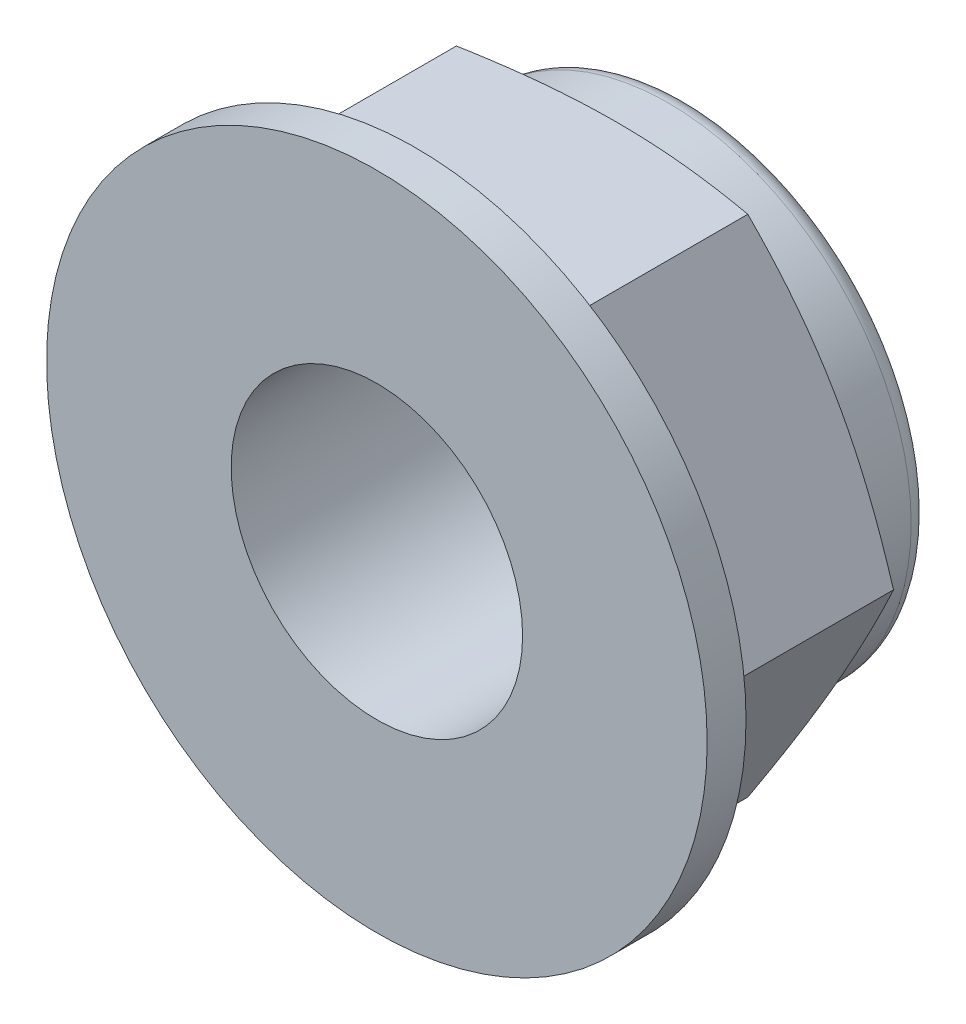
ISO-10303-21;
HEADER;
FILE_DESCRIPTION(('STEP AP214'),'2;1');
FILE_NAME('part.step','',(''),(''),'','','');
FILE_SCHEMA(('AUTOMOTIVE_DESIGN { 1 0 10303 214 1 1 1 1 }'));
ENDSEC;
DATA;
#1=APPLICATION_CONTEXT('core data for automotive mechanical design processes');
#2=APPLICATION_PROTOCOL_DEFINITION('international standard','automotive_design',2000,#1);
#3=PRODUCT_CONTEXT('',#1,'mechanical');
#4=PRODUCT('Part','Part','',(#3));
#5=PRODUCT_RELATED_PRODUCT_CATEGORY('part','',(#4));
#6=PRODUCT_DEFINITION_FORMATION('','',#4);
#7=PRODUCT_DEFINITION_CONTEXT('part definition',#1,'design');
#8=PRODUCT_DEFINITION('design','',#6,#7);
#9=PRODUCT_DEFINITION_SHAPE('','',#8);
#10=(LENGTH_UNIT() NAMED_UNIT(*) SI_UNIT(.MILLI.,.METRE.));
#11=(NAMED_UNIT(*) PLANE_ANGLE_UNIT() SI_UNIT($,.RADIAN.));
#12=(NAMED_UNIT(*) SI_UNIT($,.STERADIAN.) SOLID_ANGLE_UNIT());
#13=UNCERTAINTY_MEASURE_WITH_UNIT(LENGTH_MEASURE(1.E-05),#10,'distance_accuracy_value','');
#14=(GEOMETRIC_REPRESENTATION_CONTEXT(3) GLOBAL_UNCERTAINTY_ASSIGNED_CONTEXT((#13)) GLOBAL_UNIT_ASSIGNED_CONTEXT((#10,
#11,#12)) REPRESENTATION_CONTEXT('',''));
#15=CARTESIAN_POINT('',(0.,0.,0.));
#16=DIRECTION('',(0.,0.,1.));
#17=DIRECTION('',(1.,0.,0.));
#18=AXIS2_PLACEMENT_3D('',#15,#16,#17);
#19=CARTESIAN_POINT('',(0.,0.,-8.85685424949238));
#20=DIRECTION('',(0.,0.,1.));
#21=DIRECTION('',(1.,0.,0.));
#22=AXIS2_PLACEMENT_3D('',#19,#20,#21);
#23=CYLINDRICAL_SURFACE('',#22,1.5);
#24=CARTESIAN_POINT('',(0.,0.,-3.2));
#25=DIRECTION('',(0.,0.,1.));
#26=DIRECTION('',(1.,0.,0.));
#27=AXIS2_PLACEMENT_3D('',#24,#25,#26);
#28=CIRCLE('',#27,1.5);
#29=CARTESIAN_POINT('',(1.5,0.,-3.2));
#30=VERTEX_POINT('',#29);
#31=EDGE_CURVE('E11',#30,#30,#28,.F.);
#32=ORIENTED_EDGE('',*,*,#31,.T.);
#33=EDGE_LOOP('',(#32));
#34=FACE_BOUND('',#33,.T.);
#35=CARTESIAN_POINT('',(0.,0.,-2.5));
#36=DIRECTION('',(0.,0.,-1.));
#37=DIRECTION('',(-1.,0.,0.));
#38=AXIS2_PLACEMENT_3D('',#35,#36,#37);
#39=CIRCLE('',#38,1.5);
#40=CARTESIAN_POINT('',(-1.5,0.,-2.5));
#41=VERTEX_POINT('',#40);
#42=EDGE_CURVE('E67',#41,#41,#39,.F.);
#43=ORIENTED_EDGE('',*,*,#42,.T.);
#44=EDGE_LOOP('',(#43));
#45=FACE_BOUND('',#44,.T.);
#46=ADVANCED_FACE('F54',(#34,#45),#23,.F.);
#47=CARTESIAN_POINT('',(0.,0.,-2.5));
#48=DIRECTION('',(0.,0.,-1.));
#49=DIRECTION('',(-1.,0.,0.));
#50=AXIS2_PLACEMENT_3D('',#47,#48,#49);
#51=PLANE('',#50);
#52=ORIENTED_EDGE('',*,*,#42,.F.);
#53=EDGE_LOOP('',(#52));
#54=FACE_BOUND('',#53,.T.);
#55=CARTESIAN_POINT('',(0.,0.,-2.5));
#56=DIRECTION('',(0.,0.,-1.));
#57=DIRECTION('',(-1.,0.,0.));
#58=AXIS2_PLACEMENT_3D('',#55,#56,#57);
#59=CIRCLE('',#58,2.);
#60=CARTESIAN_POINT('',(-2.,0.,-2.5));
#61=VERTEX_POINT('',#60);
#62=EDGE_CURVE('E65',#61,#61,#59,.T.);
#63=ORIENTED_EDGE('',*,*,#62,.F.);
#64=EDGE_LOOP('',(#63));
#65=FACE_BOUND('',#64,.T.);
#66=ADVANCED_FACE('F74',(#54,#65),#51,.F.);
#67=CARTESIAN_POINT('',(0.,0.,-8.85685424949238));
#68=DIRECTION('',(0.,0.,1.));
#69=DIRECTION('',(1.,0.,0.));
#70=AXIS2_PLACEMENT_3D('',#67,#68,#69);
#71=CYLINDRICAL_SURFACE('',#70,2.);
#72=CARTESIAN_POINT('',(0.,0.,-3.2));
#73=DIRECTION('',(0.,0.,1.));
#74=DIRECTION('',(1.,0.,0.));
#75=AXIS2_PLACEMENT_3D('',#72,#73,#74);
#76=CIRCLE('',#75,2.);
#77=CARTESIAN_POINT('',(2.,0.,-3.2));
#78=VERTEX_POINT('',#77);
#79=EDGE_CURVE('E57',#78,#78,#76,.T.);
#80=ORIENTED_EDGE('',*,*,#79,.T.);
#81=EDGE_LOOP('',(#80));
#82=FACE_BOUND('',#81,.T.);
#83=ORIENTED_EDGE('',*,*,#62,.T.);
#84=EDGE_LOOP('',(#83));
#85=FACE_BOUND('',#84,.T.);
#86=ADVANCED_FACE('F72',(#82,#85),#71,.T.);
#87=CARTESIAN_POINT('',(0.,2.3,-3.2));
#88=DIRECTION('',(0.,0.,1.));
#89=DIRECTION('',(1.,0.,0.));
#90=AXIS2_PLACEMENT_3D('',#87,#88,#89);
#91=PLANE('',#90);
#92=ORIENTED_EDGE('',*,*,#79,.F.);
#93=EDGE_LOOP('',(#92));
#94=FACE_BOUND('',#93,.T.);
#95=ORIENTED_EDGE('',*,*,#31,.F.);
#96=EDGE_LOOP('',(#95));
#97=FACE_BOUND('',#96,.T.);
#98=ADVANCED_FACE('F82',(#94,#97),#91,.F.);
#99=CLOSED_SHELL('',(#46,#66,#86,#98));
#100=MANIFOLD_SOLID_BREP('B2',#99);
#101=CARTESIAN_POINT('',(0.,0.,-2.5));
#102=DIRECTION('',(0.,0.,1.));
#103=DIRECTION('',(1.,0.,0.));
#104=AXIS2_PLACEMENT_3D('',#101,#102,#103);
#105=CONICAL_SURFACE('',#104,2.5,1.22173047639603);
#106=CARTESIAN_POINT('',(0.,0.,-2.5));
#107=DIRECTION('',(0.,0.,1.));
#108=DIRECTION('',(1.,0.,0.));
#109=AXIS2_PLACEMENT_3D('',#106,#107,#108);
#110=CIRCLE('',#109,2.5);
#111=CARTESIAN_POINT('',(2.5,0.,-2.5));
#112=VERTEX_POINT('',#111);
#113=EDGE_CURVE('E253',#112,#112,#110,.T.);
#114=ORIENTED_EDGE('',*,*,#113,.T.);
#115=EDGE_LOOP('',(#114));
#116=FACE_BOUND('',#115,.T.);
#117=CARTESIAN_POINT('',(-4.50571469516586,-2.59807621135331,-1.51687917081887));
#118=CARTESIAN_POINT('',(-4.32779811556793,-2.59807621135331,-1.57293654325291));
#119=CARTESIAN_POINT('',(-4.14965887183022,-2.59807621135331,-1.62831322689943));
#120=CARTESIAN_POINT('',(-3.79272241001289,-2.59807621135331,-1.73705159704587));
#121=CARTESIAN_POINT('',(-3.61392504817484,-2.59807621135331,-1.79041281061415));
#122=CARTESIAN_POINT('',(-3.2528999887024,-2.59807621135331,-1.89520689814672));
#123=CARTESIAN_POINT('',(-3.07066058775242,-2.59807621135331,-1.94659973008191));
#124=CARTESIAN_POINT('',(-2.70513060094307,-2.59807621135331,-2.04551040607101));
#125=CARTESIAN_POINT('',(-2.52184005541164,-2.59807621135331,-2.09302839773549));
#126=CARTESIAN_POINT('',(-2.1617612107084,-2.59807621135331,-2.18069328701161));
#127=CARTESIAN_POINT('',(-1.98502912537534,-2.59807621135332,-2.2210681708868));
#128=CARTESIAN_POINT('',(-1.63007253457616,-2.59807621135332,-2.29484969220077));
#129=CARTESIAN_POINT('',(-1.45184792933102,-2.59807621135332,-2.32825585983077));
#130=CARTESIAN_POINT('',(-1.09522821218188,-2.59807621135332,-2.385355368532));
#131=CARTESIAN_POINT('',(-0.91684519829366,-2.59807621135332,-2.40912220283631));
#132=CARTESIAN_POINT('',(-0.558886294411809,-2.59807621135332,-2.44469048053334));
#133=CARTESIAN_POINT('',(-0.379310846099709,-2.59807621135332,-2.45649612996009));
#134=CARTESIAN_POINT('',(-0.101736355593338,-2.59807621135332,-2.46425060854379));
#135=CARTESIAN_POINT('',(-0.00385472737528252,-2.59807621135332,-2.46497384345033));
#136=CARTESIAN_POINT('',(0.191859652516372,-2.59807621135332,-2.46239499854921));
#137=CARTESIAN_POINT('',(0.289692403545826,-2.59807621135332,-2.45909286702255));
#138=CARTESIAN_POINT('',(0.485171584632179,-2.59807621135332,-2.448600774932));
#139=CARTESIAN_POINT('',(0.582817958938064,-2.59807621135332,-2.44140979239815));
#140=CARTESIAN_POINT('',(0.777783275282243,-2.59807621135332,-2.42343545498827));
#141=CARTESIAN_POINT('',(0.87510218487959,-2.59807621135332,-2.41265175419533));
#142=CARTESIAN_POINT('',(1.16804667956495,-2.59807621135332,-2.37528328946018));
#143=CARTESIAN_POINT('',(1.36304794433662,-2.59807621135332,-2.34377900542975));
#144=CARTESIAN_POINT('',(1.75119393230146,-2.59807621135332,-2.27116636844322));
#145=CARTESIAN_POINT('',(1.94433849681115,-2.59807621135332,-2.23005720206847));
#146=CARTESIAN_POINT('',(2.33830715076578,-2.59807621135332,-2.13897387538033));
#147=CARTESIAN_POINT('',(2.5390535047784,-2.59807621135332,-2.08866830267034));
#148=CARTESIAN_POINT('',(2.93918730041119,-2.59807621135332,-1.98299977573694));
#149=CARTESIAN_POINT('',(3.13857476697964,-2.59807621135332,-1.92763691463231));
#150=CARTESIAN_POINT('',(3.53301830486364,-2.59807621135332,-1.81434824415542));
#151=CARTESIAN_POINT('',(3.72809117357094,-2.59807621135332,-1.75648054271965));
#152=CARTESIAN_POINT('',(4.02011702551617,-2.59807621135332,-1.66786208057383));
#153=CARTESIAN_POINT('',(4.11734894760366,-2.59807621135332,-1.63802383037466));
#154=CARTESIAN_POINT('',(4.31164862784752,-2.59807621135332,-1.5778235583558));
#155=CARTESIAN_POINT('',(4.40871638899947,-2.59807621135332,-1.54746154620939));
#156=CARTESIAN_POINT('',(4.50571469516586,-2.59807621135332,-1.51687917081887));
#157=B_SPLINE_CURVE_WITH_KNOTS('',3,(#117,#118,#119,#120,#121,#122,#123,#124,#125,#126,#127,
#128,#129,#130,#131,#132,#133,#134,#135,#136,#137,#138,#139,#140,#141,#142,#143,#144,#145,#146,
#147,#148,#149,#150,#151,#152,#153,#154,#155,#156),.UNSPECIFIED.,.F.,.F.,(4,2,2,2,2,2,2,2,2,2,2,
2,2,2,2,2,2,2,2,4),(0.,0.559626958823651,1.11938442890335,1.68739666284076,2.25538724844898,
2.79914526213936,3.34293992243372,3.8825068495447,4.42188397728699,4.71546236493174,
5.00904452459009,5.30270387364152,5.5963915052063,6.18860118782471,6.7808610417095,
7.40162268128691,8.022372893215,8.63277535901952,8.9378961099399,9.24301123164942),.UNSPECIFIED.);
#158=CARTESIAN_POINT('',(-1.5,-2.59807621135332,-2.3180148828669));
#159=VERTEX_POINT('',#158);
#160=CARTESIAN_POINT('',(1.5,-2.59807621135332,-2.3180148828669));
#161=VERTEX_POINT('',#160);
#162=EDGE_CURVE('E177',#159,#161,#157,.T.);
#163=ORIENTED_EDGE('',*,*,#162,.F.);
#164=CARTESIAN_POINT('',(-3.00011547005384,0.000200000000000867,-2.31797285277798));
#165=CARTESIAN_POINT('',(-2.93798767313402,-0.107408500827437,-2.34059556023408));
#166=CARTESIAN_POINT('',(-2.87565498547437,-0.215371882826277,-2.36117494789189));
#167=CARTESIAN_POINT('',(-2.75058425600689,-0.432000740803658,-2.39738134357596));
#168=CARTESIAN_POINT('',(-2.6878459358738,-0.540666698855697,-2.41300447505696));
#169=CARTESIAN_POINT('',(-2.56266030075154,-0.757494579265222,-2.43827449560428));
#170=CARTESIAN_POINT('',(-2.50021584564009,-0.865651548169216,-2.44797651058499));
#171=CARTESIAN_POINT('',(-2.37518088461241,-1.08221845339155,-2.46098965337451));
#172=CARTESIAN_POINT('',(-2.3125904423062,-1.1906282795341,-2.46430317837779));
#173=CARTESIAN_POINT('',(-2.18740955769379,-1.40744793181921,-2.46430317837779));
#174=CARTESIAN_POINT('',(-2.12481911538759,-1.51585775796177,-2.46098965337451));
#175=CARTESIAN_POINT('',(-1.99978415435991,-1.7324246631841,-2.44797651058499));
#176=CARTESIAN_POINT('',(-1.93733969924846,-1.84058163208809,-2.43827449560428));
#177=CARTESIAN_POINT('',(-1.8121540641262,-2.05740951249762,-2.41300447505696));
#178=CARTESIAN_POINT('',(-1.74941574399311,-2.16607547054966,-2.39738134357596));
#179=CARTESIAN_POINT('',(-1.62434501452563,-2.38270432852704,-2.36117494789189));
#180=CARTESIAN_POINT('',(-1.56201232686597,-2.49066771052588,-2.34059556023408));
#181=CARTESIAN_POINT('',(-1.49988452994616,-2.59827621135332,-2.31797285277798));
#182=B_SPLINE_CURVE_WITH_KNOTS('',3,(#164,#165,#166,#167,#168,#169,#170,#171,#172,#173,#174,
#175,#176,#177,#178,#179,#180,#181),.UNSPECIFIED.,.F.,.F.,(4,2,2,2,2,2,2,2,4),(0.,
0.378933747339801,0.758163151845412,1.13380579385752,1.50930745359413,1.88480911333075,
2.26045175534286,2.63968115984847,3.01861490718827),.UNSPECIFIED.);
#183=CARTESIAN_POINT('',(-3.,0.,-2.3180148828669));
#184=VERTEX_POINT('',#183);
#185=EDGE_CURVE('E301',#184,#159,#182,.T.);
#186=ORIENTED_EDGE('',*,*,#185,.F.);
#187=CARTESIAN_POINT('',(-1.49988452994616,2.59827621135332,-2.31797285277798));
#188=CARTESIAN_POINT('',(-1.56201232686597,2.49066771052588,-2.34059556023408));
#189=CARTESIAN_POINT('',(-1.62434501452563,2.38270432852704,-2.36117494789189));
#190=CARTESIAN_POINT('',(-1.74941574399311,2.16607547054966,-2.39738134357596));
#191=CARTESIAN_POINT('',(-1.8121540641262,2.05740951249762,-2.41300447505696));
#192=CARTESIAN_POINT('',(-1.93733969924846,1.84058163208809,-2.43827449560428));
#193=CARTESIAN_POINT('',(-1.99978415435991,1.7324246631841,-2.44797651058499));
#194=CARTESIAN_POINT('',(-2.12481911538759,1.51585775796177,-2.46098965337451));
#195=CARTESIAN_POINT('',(-2.1874095576938,1.40744793181921,-2.46430317837779));
#196=CARTESIAN_POINT('',(-2.3125904423062,1.1906282795341,-2.46430317837779));
#197=CARTESIAN_POINT('',(-2.37518088461241,1.08221845339155,-2.46098965337451));
#198=CARTESIAN_POINT('',(-2.50021584564009,0.865651548169217,-2.44797651058499));
#199=CARTESIAN_POINT('',(-2.56266030075154,0.757494579265223,-2.43827449560428));
#200=CARTESIAN_POINT('',(-2.6878459358738,0.540666698855698,-2.41300447505696));
#201=CARTESIAN_POINT('',(-2.75058425600689,0.43200074080366,-2.39738134357596));
#202=CARTESIAN_POINT('',(-2.87565498547437,0.215371882826279,-2.36117494789189));
#203=CARTESIAN_POINT('',(-2.93798767313402,0.107408500827439,-2.34059556023408));
#204=CARTESIAN_POINT('',(-3.00011547005384,-0.000199999999998509,-2.31797285277798));
#205=B_SPLINE_CURVE_WITH_KNOTS('',3,(#187,#188,#189,#190,#191,#192,#193,#194,#195,#196,#197,
#198,#199,#200,#201,#202,#203,#204),.UNSPECIFIED.,.F.,.F.,(4,2,2,2,2,2,2,2,4),(0.,
0.3789337473398,0.758163151845411,1.13380579385752,1.50930745359413,1.88480911333074,
2.26045175534285,2.63968115984846,3.01861490718826),.UNSPECIFIED.);
#206=CARTESIAN_POINT('',(-1.5,2.59807621135332,-2.3180148828669));
#207=VERTEX_POINT('',#206);
#208=EDGE_CURVE('E345',#207,#184,#205,.T.);
#209=ORIENTED_EDGE('',*,*,#208,.F.);
#210=CARTESIAN_POINT('',(4.50571469516586,2.59807621135332,-1.51687917081887));
#211=CARTESIAN_POINT('',(4.32779811556793,2.59807621135332,-1.57293654325291));
#212=CARTESIAN_POINT('',(4.14965887183023,2.59807621135332,-1.62831322689943));
#213=CARTESIAN_POINT('',(3.79272241001289,2.59807621135332,-1.73705159704587));
#214=CARTESIAN_POINT('',(3.61392504817484,2.59807621135332,-1.79041281061414));
#215=CARTESIAN_POINT('',(3.2528999887024,2.59807621135332,-1.89520689814672));
#216=CARTESIAN_POINT('',(3.07066058775242,2.59807621135332,-1.94659973008191));
#217=CARTESIAN_POINT('',(2.70513060094307,2.59807621135332,-2.04551040607101));
#218=CARTESIAN_POINT('',(2.52184005541164,2.59807621135332,-2.09302839773549));
#219=CARTESIAN_POINT('',(2.1617612107084,2.59807621135332,-2.18069328701161));
#220=CARTESIAN_POINT('',(1.98502912537534,2.59807621135332,-2.2210681708868));
#221=CARTESIAN_POINT('',(1.63007253457616,2.59807621135332,-2.29484969220077));
#222=CARTESIAN_POINT('',(1.45184792933102,2.59807621135332,-2.32825585983077));
#223=CARTESIAN_POINT('',(1.09522821218188,2.59807621135332,-2.385355368532));
#224=CARTESIAN_POINT('',(0.916845198293658,2.59807621135332,-2.40912220283631));
#225=CARTESIAN_POINT('',(0.558886294411807,2.59807621135332,-2.44469048053334));
#226=CARTESIAN_POINT('',(0.379310846099707,2.59807621135332,-2.45649612996009));
#227=CARTESIAN_POINT('',(0.101736355593336,2.59807621135332,-2.46425060854379));
#228=CARTESIAN_POINT('',(0.00385472737528034,2.59807621135332,-2.46497384345034));
#229=CARTESIAN_POINT('',(-0.191859652516374,2.59807621135332,-2.46239499854921));
#230=CARTESIAN_POINT('',(-0.289692403545828,2.59807621135332,-2.45909286702255));
#231=CARTESIAN_POINT('',(-0.485171584632181,2.59807621135332,-2.448600774932));
#232=CARTESIAN_POINT('',(-0.582817958938066,2.59807621135332,-2.44140979239815));
#233=CARTESIAN_POINT('',(-0.777783275282245,2.59807621135332,-2.42343545498827));
#234=CARTESIAN_POINT('',(-0.875102184879593,2.59807621135332,-2.41265175419533));
#235=CARTESIAN_POINT('',(-1.16804667956495,2.59807621135332,-2.37528328946018));
#236=CARTESIAN_POINT('',(-1.36304794433663,2.59807621135332,-2.34377900542975));
#237=CARTESIAN_POINT('',(-1.75119393230146,2.59807621135332,-2.27116636844322));
#238=CARTESIAN_POINT('',(-1.94433849681115,2.59807621135332,-2.23005720206847));
#239=CARTESIAN_POINT('',(-2.33830715076578,2.59807621135332,-2.13897387538033));
#240=CARTESIAN_POINT('',(-2.5390535047784,2.59807621135332,-2.08866830267034));
#241=CARTESIAN_POINT('',(-2.93918730041119,2.59807621135332,-1.98299977573694));
#242=CARTESIAN_POINT('',(-3.13857476697965,2.59807621135332,-1.92763691463231));
#243=CARTESIAN_POINT('',(-3.53301830486365,2.59807621135332,-1.81434824415542));
#244=CARTESIAN_POINT('',(-3.72809117357095,2.59807621135332,-1.75648054271965));
#245=CARTESIAN_POINT('',(-4.02011702551618,2.59807621135332,-1.66786208057382));
#246=CARTESIAN_POINT('',(-4.11734894760367,2.59807621135332,-1.63802383037466));
#247=CARTESIAN_POINT('',(-4.31164862784752,2.59807621135332,-1.5778235583558));
#248=CARTESIAN_POINT('',(-4.40871638899948,2.59807621135332,-1.54746154620939));
#249=CARTESIAN_POINT('',(-4.50571469516586,2.59807621135332,-1.51687917081887));
#250=B_SPLINE_CURVE_WITH_KNOTS('',3,(#210,#211,#212,#213,#214,#215,#216,#217,#218,#219,#220,
#221,#222,#223,#224,#225,#226,#227,#228,#229,#230,#231,#232,#233,#234,#235,#236,#237,#238,#239,
#240,#241,#242,#243,#244,#245,#246,#247,#248,#249),.UNSPECIFIED.,.F.,.F.,(4,2,2,2,2,2,2,2,2,2,2,
2,2,2,2,2,2,2,2,4),(0.,0.559626958823651,1.11938442890335,1.68739666284076,2.25538724844898,
2.79914526213936,3.34293992243373,3.8825068495447,4.421883977287,4.71546236493174,
5.00904452459009,5.30270387364152,5.5963915052063,6.18860118782472,6.7808610417095,
7.40162268128692,8.022372893215,8.63277535901952,8.93789610993991,9.24301123164943),.UNSPECIFIED.);
#251=CARTESIAN_POINT('',(1.5,2.59807621135332,-2.3180148828669));
#252=VERTEX_POINT('',#251);
#253=EDGE_CURVE('E203',#252,#207,#250,.T.);
#254=ORIENTED_EDGE('',*,*,#253,.F.);
#255=CARTESIAN_POINT('',(3.00011547005384,-0.000200000000000263,-2.31797285277798));
#256=CARTESIAN_POINT('',(2.93798767313402,0.107408500827437,-2.34059556023408));
#257=CARTESIAN_POINT('',(2.87565498547437,0.215371882826278,-2.36117494789189));
#258=CARTESIAN_POINT('',(2.75058425600689,0.432000740803658,-2.39738134357596));
#259=CARTESIAN_POINT('',(2.6878459358738,0.540666698855697,-2.41300447505696));
#260=CARTESIAN_POINT('',(2.56266030075154,0.757494579265222,-2.43827449560428));
#261=CARTESIAN_POINT('',(2.50021584564009,0.865651548169215,-2.44797651058499));
#262=CARTESIAN_POINT('',(2.37518088461241,1.08221845339155,-2.46098965337451));
#263=CARTESIAN_POINT('',(2.3125904423062,1.1906282795341,-2.46430317837779));
#264=CARTESIAN_POINT('',(2.18740955769379,1.40744793181921,-2.46430317837779));
#265=CARTESIAN_POINT('',(2.12481911538759,1.51585775796177,-2.46098965337451));
#266=CARTESIAN_POINT('',(1.99978415435991,1.7324246631841,-2.44797651058499));
#267=CARTESIAN_POINT('',(1.93733969924846,1.84058163208809,-2.43827449560428));
#268=CARTESIAN_POINT('',(1.8121540641262,2.05740951249762,-2.41300447505696));
#269=CARTESIAN_POINT('',(1.74941574399311,2.16607547054966,-2.39738134357596));
#270=CARTESIAN_POINT('',(1.62434501452563,2.38270432852704,-2.36117494789189));
#271=CARTESIAN_POINT('',(1.56201232686597,2.49066771052588,-2.34059556023408));
#272=CARTESIAN_POINT('',(1.49988452994616,2.59827621135332,-2.31797285277798));
#273=B_SPLINE_CURVE_WITH_KNOTS('',3,(#255,#256,#257,#258,#259,#260,#261,#262,#263,#264,#265,
#266,#267,#268,#269,#270,#271,#272),.UNSPECIFIED.,.F.,.F.,(4,2,2,2,2,2,2,2,4),(0.,
0.378933747339801,0.758163151845411,1.13380579385752,1.50930745359413,1.88480911333075,
2.26045175534285,2.63968115984846,3.01861490718827),.UNSPECIFIED.);
#274=CARTESIAN_POINT('',(3.,0.,-2.3180148828669));
#275=VERTEX_POINT('',#274);
#276=EDGE_CURVE('E237',#275,#252,#273,.T.);
#277=ORIENTED_EDGE('',*,*,#276,.F.);
#278=CARTESIAN_POINT('',(1.49988452994616,-2.59827621135332,-2.31797285277798));
#279=CARTESIAN_POINT('',(1.56201232686597,-2.49066771052588,-2.34059556023408));
#280=CARTESIAN_POINT('',(1.62434501452562,-2.38270432852704,-2.36117494789189));
#281=CARTESIAN_POINT('',(1.74941574399311,-2.16607547054966,-2.39738134357596));
#282=CARTESIAN_POINT('',(1.8121540641262,-2.05740951249762,-2.41300447505696));
#283=CARTESIAN_POINT('',(1.93733969924846,-1.84058163208809,-2.43827449560428));
#284=CARTESIAN_POINT('',(1.99978415435991,-1.7324246631841,-2.44797651058499));
#285=CARTESIAN_POINT('',(2.12481911538759,-1.51585775796177,-2.46098965337451));
#286=CARTESIAN_POINT('',(2.18740955769379,-1.40744793181921,-2.46430317837779));
#287=CARTESIAN_POINT('',(2.3125904423062,-1.1906282795341,-2.46430317837779));
#288=CARTESIAN_POINT('',(2.37518088461241,-1.08221845339155,-2.46098965337451));
#289=CARTESIAN_POINT('',(2.50021584564008,-0.865651548169216,-2.44797651058499));
#290=CARTESIAN_POINT('',(2.56266030075154,-0.757494579265223,-2.43827449560428));
#291=CARTESIAN_POINT('',(2.68784593587379,-0.540666698855698,-2.41300447505696));
#292=CARTESIAN_POINT('',(2.75058425600689,-0.432000740803659,-2.39738134357596));
#293=CARTESIAN_POINT('',(2.87565498547437,-0.215371882826279,-2.36117494789189));
#294=CARTESIAN_POINT('',(2.93798767313402,-0.107408500827438,-2.34059556023408));
#295=CARTESIAN_POINT('',(3.00011547005384,0.000199999999999296,-2.31797285277798));
#296=B_SPLINE_CURVE_WITH_KNOTS('',3,(#278,#279,#280,#281,#282,#283,#284,#285,#286,#287,#288,
#289,#290,#291,#292,#293,#294,#295),.UNSPECIFIED.,.F.,.F.,(4,2,2,2,2,2,2,2,4),(0.,
0.3789337473398,0.758163151845412,1.13380579385752,1.50930745359413,1.88480911333075,
2.26045175534285,2.63968115984847,3.01861490718827),.UNSPECIFIED.);
#297=EDGE_CURVE('E181',#161,#275,#296,.T.);
#298=ORIENTED_EDGE('',*,*,#297,.F.);
#299=EDGE_LOOP('',(#163,#186,#209,#254,#277,#298));
#300=FACE_BOUND('',#299,.T.);
#301=ADVANCED_FACE('F118',(#116,#300),#105,.T.);
#302=CARTESIAN_POINT('',(0.,0.,0.));
#303=DIRECTION('',(0.,0.,1.));
#304=DIRECTION('',(1.,0.,0.));
#305=AXIS2_PLACEMENT_3D('',#302,#303,#304);
#306=CYLINDRICAL_SURFACE('',#305,3.);
#307=CARTESIAN_POINT('',(0.,0.,-0.470530792283383));
#308=DIRECTION('',(0.,0.,1.));
#309=DIRECTION('',(1.,0.,0.));
#310=AXIS2_PLACEMENT_3D('',#307,#308,#309);
#311=CIRCLE('',#310,3.);
#312=CARTESIAN_POINT('',(3.,0.,-0.470530792283383));
#313=VERTEX_POINT('',#312);
#314=EDGE_CURVE('E250',#313,#313,#311,.T.);
#315=ORIENTED_EDGE('',*,*,#314,.F.);
#316=EDGE_LOOP('',(#315));
#317=FACE_BOUND('',#316,.T.);
#318=CARTESIAN_POINT('',(0.,0.,-0.471));
#319=DIRECTION('',(0.,0.,-1.));
#320=DIRECTION('',(-1.,0.,0.));
#321=AXIS2_PLACEMENT_3D('',#318,#319,#320);
#322=CIRCLE('',#321,3.);
#323=CARTESIAN_POINT('',(1.5,-2.59807621135332,-0.471));
#324=VERTEX_POINT('',#323);
#325=CARTESIAN_POINT('',(-1.5,-2.59807621135332,-0.471));
#326=VERTEX_POINT('',#325);
#327=EDGE_CURVE('E132',#324,#326,#322,.T.);
#328=ORIENTED_EDGE('',*,*,#327,.F.);
#329=CARTESIAN_POINT('',(0.,0.,-0.471));
#330=DIRECTION('',(0.,0.,-1.));
#331=DIRECTION('',(-1.,0.,0.));
#332=AXIS2_PLACEMENT_3D('',#329,#330,#331);
#333=CIRCLE('',#332,3.);
#334=CARTESIAN_POINT('',(3.,0.,-0.471));
#335=VERTEX_POINT('',#334);
#336=EDGE_CURVE('E182',#335,#324,#333,.T.);
#337=ORIENTED_EDGE('',*,*,#336,.F.);
#338=CARTESIAN_POINT('',(0.,0.,-0.471));
#339=DIRECTION('',(0.,0.,-1.));
#340=DIRECTION('',(-1.,0.,0.));
#341=AXIS2_PLACEMENT_3D('',#338,#339,#340);
#342=CIRCLE('',#341,3.);
#343=CARTESIAN_POINT('',(1.5,2.59807621135332,-0.471));
#344=VERTEX_POINT('',#343);
#345=EDGE_CURVE('E353',#344,#335,#342,.T.);
#346=ORIENTED_EDGE('',*,*,#345,.F.);
#347=CARTESIAN_POINT('',(0.,0.,-0.471));
#348=DIRECTION('',(0.,0.,-1.));
#349=DIRECTION('',(-1.,0.,0.));
#350=AXIS2_PLACEMENT_3D('',#347,#348,#349);
#351=CIRCLE('',#350,3.);
#352=CARTESIAN_POINT('',(-1.5,2.59807621135332,-0.471));
#353=VERTEX_POINT('',#352);
#354=EDGE_CURVE('E139',#353,#344,#351,.T.);
#355=ORIENTED_EDGE('',*,*,#354,.F.);
#356=CARTESIAN_POINT('',(0.,0.,-0.471));
#357=DIRECTION('',(0.,0.,-1.));
#358=DIRECTION('',(-1.,0.,0.));
#359=AXIS2_PLACEMENT_3D('',#356,#357,#358);
#360=CIRCLE('',#359,3.);
#361=CARTESIAN_POINT('',(-3.,0.,-0.471));
#362=VERTEX_POINT('',#361);
#363=EDGE_CURVE('E355',#362,#353,#360,.T.);
#364=ORIENTED_EDGE('',*,*,#363,.F.);
#365=CARTESIAN_POINT('',(0.,0.,-0.471));
#366=DIRECTION('',(0.,0.,-1.));
#367=DIRECTION('',(-1.,0.,0.));
#368=AXIS2_PLACEMENT_3D('',#365,#366,#367);
#369=CIRCLE('',#368,3.);
#370=EDGE_CURVE('E195',#326,#362,#369,.T.);
#371=ORIENTED_EDGE('',*,*,#370,.F.);
#372=EDGE_LOOP('',(#328,#337,#346,#355,#364,#371));
#373=FACE_BOUND('',#372,.T.);
#374=ADVANCED_FACE('F189',(#317,#373),#306,.T.);
#375=CARTESIAN_POINT('',(0.,0.,0.));
#376=DIRECTION('',(0.,0.,1.));
#377=DIRECTION('',(1.,0.,0.));
#378=AXIS2_PLACEMENT_3D('',#375,#376,#377);
#379=CYLINDRICAL_SURFACE('',#378,3.4);
#380=CARTESIAN_POINT('',(0.,0.,0.));
#381=DIRECTION('',(0.,0.,1.));
#382=DIRECTION('',(1.,0.,0.));
#383=AXIS2_PLACEMENT_3D('',#380,#381,#382);
#384=CIRCLE('',#383,3.4);
#385=CARTESIAN_POINT('',(3.4,0.,0.));
#386=VERTEX_POINT('',#385);
#387=EDGE_CURVE('E52',#386,#386,#384,.T.);
#388=ORIENTED_EDGE('',*,*,#387,.F.);
#389=EDGE_LOOP('',(#388));
#390=FACE_BOUND('',#389,.T.);
#391=CARTESIAN_POINT('',(0.,0.,-0.4));
#392=DIRECTION('',(0.,0.,1.));
#393=DIRECTION('',(1.,0.,0.));
#394=AXIS2_PLACEMENT_3D('',#391,#392,#393);
#395=CIRCLE('',#394,3.4);
#396=CARTESIAN_POINT('',(3.4,0.,-0.4));
#397=VERTEX_POINT('',#396);
#398=EDGE_CURVE('E245',#397,#397,#395,.T.);
#399=ORIENTED_EDGE('',*,*,#398,.T.);
#400=EDGE_LOOP('',(#399));
#401=FACE_BOUND('',#400,.T.);
#402=ADVANCED_FACE('F120',(#390,#401),#379,.T.);
#403=CARTESIAN_POINT('',(0.,1.5,0.));
#404=DIRECTION('',(0.,0.,-1.));
#405=DIRECTION('',(-1.,0.,0.));
#406=AXIS2_PLACEMENT_3D('',#403,#404,#405);
#407=PLANE('',#406);
#408=CARTESIAN_POINT('',(0.,0.,0.));
#409=DIRECTION('',(0.,0.,1.));
#410=DIRECTION('',(1.,0.,0.));
#411=AXIS2_PLACEMENT_3D('',#408,#409,#410);
#412=CIRCLE('',#411,1.5);
#413=CARTESIAN_POINT('',(1.5,0.,0.));
#414=VERTEX_POINT('',#413);
#415=EDGE_CURVE('E126',#414,#414,#412,.T.);
#416=ORIENTED_EDGE('',*,*,#415,.F.);
#417=EDGE_LOOP('',(#416));
#418=FACE_BOUND('',#417,.T.);
#419=ORIENTED_EDGE('',*,*,#387,.T.);
#420=EDGE_LOOP('',(#419));
#421=FACE_BOUND('',#420,.T.);
#422=ADVANCED_FACE('F275',(#418,#421),#407,.F.);
#423=CARTESIAN_POINT('',(0.,0.,0.));
#424=DIRECTION('',(0.,0.,1.));
#425=DIRECTION('',(1.,0.,0.));
#426=AXIS2_PLACEMENT_3D('',#423,#424,#425);
#427=CYLINDRICAL_SURFACE('',#426,1.5);
#428=CARTESIAN_POINT('',(0.,0.,-2.5));
#429=DIRECTION('',(0.,0.,1.));
#430=DIRECTION('',(1.,0.,0.));
#431=AXIS2_PLACEMENT_3D('',#428,#429,#430);
#432=CIRCLE('',#431,1.5);
#433=CARTESIAN_POINT('',(1.5,0.,-2.5));
#434=VERTEX_POINT('',#433);
#435=EDGE_CURVE('E268',#434,#434,#432,.T.);
#436=ORIENTED_EDGE('',*,*,#435,.F.);
#437=EDGE_LOOP('',(#436));
#438=FACE_BOUND('',#437,.T.);
#439=ORIENTED_EDGE('',*,*,#415,.T.);
#440=EDGE_LOOP('',(#439));
#441=FACE_BOUND('',#440,.T.);
#442=ADVANCED_FACE('F273',(#438,#441),#427,.F.);
#443=CARTESIAN_POINT('',(0.,2.,-2.5));
#444=DIRECTION('',(0.,0.,1.));
#445=DIRECTION('',(1.,0.,0.));
#446=AXIS2_PLACEMENT_3D('',#443,#444,#445);
#447=PLANE('',#446);
#448=CARTESIAN_POINT('',(0.,0.,-2.5));
#449=DIRECTION('',(0.,0.,1.));
#450=DIRECTION('',(1.,0.,0.));
#451=AXIS2_PLACEMENT_3D('',#448,#449,#450);
#452=CIRCLE('',#451,2.);
#453=CARTESIAN_POINT('',(2.,0.,-2.5));
#454=VERTEX_POINT('',#453);
#455=EDGE_CURVE('E265',#454,#454,#452,.T.);
#456=ORIENTED_EDGE('',*,*,#455,.F.);
#457=EDGE_LOOP('',(#456));
#458=FACE_BOUND('',#457,.T.);
#459=ORIENTED_EDGE('',*,*,#435,.T.);
#460=EDGE_LOOP('',(#459));
#461=FACE_BOUND('',#460,.T.);
#462=ADVANCED_FACE('F461',(#458,#461),#447,.F.);
#463=CARTESIAN_POINT('',(0.,0.,0.));
#464=DIRECTION('',(0.,0.,1.));
#465=DIRECTION('',(1.,0.,0.));
#466=AXIS2_PLACEMENT_3D('',#463,#464,#465);
#467=CYLINDRICAL_SURFACE('',#466,2.);
#468=CARTESIAN_POINT('',(0.,0.,-3.2));
#469=DIRECTION('',(0.,0.,1.));
#470=DIRECTION('',(1.,0.,0.));
#471=AXIS2_PLACEMENT_3D('',#468,#469,#470);
#472=CIRCLE('',#471,2.);
#473=CARTESIAN_POINT('',(2.,0.,-3.2));
#474=VERTEX_POINT('',#473);
#475=EDGE_CURVE('E262',#474,#474,#472,.T.);
#476=ORIENTED_EDGE('',*,*,#475,.F.);
#477=EDGE_LOOP('',(#476));
#478=FACE_BOUND('',#477,.T.);
#479=ORIENTED_EDGE('',*,*,#455,.T.);
#480=EDGE_LOOP('',(#479));
#481=FACE_BOUND('',#480,.T.);
#482=ADVANCED_FACE('F453',(#478,#481),#467,.F.);
#483=CARTESIAN_POINT('',(0.,2.3,-3.2));
#484=DIRECTION('',(0.,0.,1.));
#485=DIRECTION('',(1.,0.,0.));
#486=AXIS2_PLACEMENT_3D('',#483,#484,#485);
#487=PLANE('',#486);
#488=CARTESIAN_POINT('',(0.,0.,-3.2));
#489=DIRECTION('',(0.,0.,1.));
#490=DIRECTION('',(1.,0.,0.));
#491=AXIS2_PLACEMENT_3D('',#488,#489,#490);
#492=CIRCLE('',#491,2.3);
#493=CARTESIAN_POINT('',(2.3,0.,-3.2));
#494=VERTEX_POINT('',#493);
#495=EDGE_CURVE('E259',#494,#494,#492,.T.);
#496=ORIENTED_EDGE('',*,*,#495,.F.);
#497=EDGE_LOOP('',(#496));
#498=FACE_BOUND('',#497,.T.);
#499=ORIENTED_EDGE('',*,*,#475,.T.);
#500=EDGE_LOOP('',(#499));
#501=FACE_BOUND('',#500,.T.);
#502=ADVANCED_FACE('F445',(#498,#501),#487,.F.);
#503=CARTESIAN_POINT('',(0.,0.,-3.));
#504=DIRECTION('',(0.,0.,1.));
#505=DIRECTION('',(1.,0.,0.));
#506=AXIS2_PLACEMENT_3D('',#503,#504,#505);
#507=TOROIDAL_SURFACE('',#506,2.3,0.2);
#508=CARTESIAN_POINT('',(0.,0.,-3.));
#509=DIRECTION('',(0.,0.,1.));
#510=DIRECTION('',(1.,0.,0.));
#511=AXIS2_PLACEMENT_3D('',#508,#509,#510);
#512=CIRCLE('',#511,2.5);
#513=CARTESIAN_POINT('',(2.5,0.,-3.));
#514=VERTEX_POINT('',#513);
#515=EDGE_CURVE('E256',#514,#514,#512,.T.);
#516=ORIENTED_EDGE('',*,*,#515,.F.);
#517=EDGE_LOOP('',(#516));
#518=FACE_BOUND('',#517,.T.);
#519=ORIENTED_EDGE('',*,*,#495,.T.);
#520=EDGE_LOOP('',(#519));
#521=FACE_BOUND('',#520,.T.);
#522=ADVANCED_FACE('F438',(#518,#521),#507,.T.);
#523=CARTESIAN_POINT('',(0.,0.,0.));
#524=DIRECTION('',(0.,0.,1.));
#525=DIRECTION('',(1.,0.,0.));
#526=AXIS2_PLACEMENT_3D('',#523,#524,#525);
#527=CYLINDRICAL_SURFACE('',#526,2.5);
#528=ORIENTED_EDGE('',*,*,#113,.F.);
#529=EDGE_LOOP('',(#528));
#530=FACE_BOUND('',#529,.T.);
#531=ORIENTED_EDGE('',*,*,#515,.T.);
#532=EDGE_LOOP('',(#531));
#533=FACE_BOUND('',#532,.T.);
#534=ADVANCED_FACE('F286',(#530,#533),#527,.T.);
#535=CARTESIAN_POINT('',(0.,0.,-0.470530792283383));
#536=DIRECTION('',(0.,0.,1.));
#537=DIRECTION('',(1.,0.,0.));
#538=AXIS2_PLACEMENT_3D('',#535,#536,#537);
#539=CONICAL_SURFACE('',#538,3.,1.39626340159547);
#540=ORIENTED_EDGE('',*,*,#398,.F.);
#541=EDGE_LOOP('',(#540));
#542=FACE_BOUND('',#541,.T.);
#543=ORIENTED_EDGE('',*,*,#314,.T.);
#544=EDGE_LOOP('',(#543));
#545=FACE_BOUND('',#544,.T.);
#546=ADVANCED_FACE('F234',(#542,#545),#539,.T.);
#547=CARTESIAN_POINT('',(2.25,1.29903810567666,-0.471));
#548=DIRECTION('',(0.866025403784439,0.5,0.));
#549=DIRECTION('',(-0.5,0.866025403784439,0.));
#550=AXIS2_PLACEMENT_3D('',#547,#548,#549);
#551=PLANE('',#550);
#552=ORIENTED_EDGE('',*,*,#276,.T.);
#553=DIRECTION('',(0.,0.,-1.));
#554=VECTOR('',#553,1.);
#555=CARTESIAN_POINT('',(1.5,2.59807621135332,-0.471));
#556=LINE('',#555,#554);
#557=EDGE_CURVE('E246',#344,#252,#556,.T.);
#558=ORIENTED_EDGE('',*,*,#557,.F.);
#559=DIRECTION('',(0.5,-0.866025403784439,0.));
#560=VECTOR('',#559,1.);
#561=CARTESIAN_POINT('',(2.25,1.29903810567666,-0.471));
#562=LINE('',#561,#560);
#563=EDGE_CURVE('E216',#344,#335,#562,.T.);
#564=ORIENTED_EDGE('',*,*,#563,.T.);
#565=DIRECTION('',(0.,0.,-1.));
#566=VECTOR('',#565,1.);
#567=CARTESIAN_POINT('',(3.,0.,-0.471));
#568=LINE('',#567,#566);
#569=EDGE_CURVE('E201',#335,#275,#568,.T.);
#570=ORIENTED_EDGE('',*,*,#569,.T.);
#571=EDGE_LOOP('',(#552,#558,#564,#570));
#572=FACE_BOUND('',#571,.T.);
#573=ADVANCED_FACE('F229',(#572),#551,.T.);
#574=CARTESIAN_POINT('',(0.,0.,-0.471));
#575=DIRECTION('',(0.,0.,-1.));
#576=DIRECTION('',(-1.,0.,0.));
#577=AXIS2_PLACEMENT_3D('',#574,#575,#576);
#578=PLANE('',#577);
#579=ORIENTED_EDGE('',*,*,#563,.F.);
#580=ORIENTED_EDGE('',*,*,#345,.T.);
#581=EDGE_LOOP('',(#579,#580));
#582=FACE_BOUND('',#581,.T.);
#583=ADVANCED_FACE('F225',(#582),#578,.T.);
#584=CARTESIAN_POINT('',(2.25,-1.29903810567666,-0.471));
#585=DIRECTION('',(0.866025403784439,-0.5,0.));
#586=DIRECTION('',(0.5,0.866025403784439,0.));
#587=AXIS2_PLACEMENT_3D('',#584,#585,#586);
#588=PLANE('',#587);
#589=ORIENTED_EDGE('',*,*,#297,.T.);
#590=ORIENTED_EDGE('',*,*,#569,.F.);
#591=DIRECTION('',(-0.5,-0.866025403784439,0.));
#592=VECTOR('',#591,1.);
#593=CARTESIAN_POINT('',(2.25,-1.29903810567666,-0.471));
#594=LINE('',#593,#592);
#595=EDGE_CURVE('E198',#335,#324,#594,.T.);
#596=ORIENTED_EDGE('',*,*,#595,.T.);
#597=DIRECTION('',(0.,0.,-1.));
#598=VECTOR('',#597,1.);
#599=CARTESIAN_POINT('',(1.5,-2.59807621135332,-0.471));
#600=LINE('',#599,#598);
#601=EDGE_CURVE('E172',#324,#161,#600,.T.);
#602=ORIENTED_EDGE('',*,*,#601,.T.);
#603=EDGE_LOOP('',(#589,#590,#596,#602));
#604=FACE_BOUND('',#603,.T.);
#605=ADVANCED_FACE('F199',(#604),#588,.T.);
#606=CARTESIAN_POINT('',(0.,0.,-0.471));
#607=DIRECTION('',(0.,0.,-1.));
#608=DIRECTION('',(-1.,0.,0.));
#609=AXIS2_PLACEMENT_3D('',#606,#607,#608);
#610=PLANE('',#609);
#611=ORIENTED_EDGE('',*,*,#595,.F.);
#612=ORIENTED_EDGE('',*,*,#336,.T.);
#613=EDGE_LOOP('',(#611,#612));
#614=FACE_BOUND('',#613,.T.);
#615=ADVANCED_FACE('F205',(#614),#610,.T.);
#616=CARTESIAN_POINT('',(0.,2.59807621135332,-0.471));
#617=DIRECTION('',(0.,1.,0.));
#618=DIRECTION('',(0.,0.,1.));
#619=AXIS2_PLACEMENT_3D('',#616,#617,#618);
#620=PLANE('',#619);
#621=ORIENTED_EDGE('',*,*,#253,.T.);
#622=DIRECTION('',(0.,0.,-1.));
#623=VECTOR('',#622,1.);
#624=CARTESIAN_POINT('',(-1.5,2.59807621135332,-0.471));
#625=LINE('',#624,#623);
#626=EDGE_CURVE('E341',#353,#207,#625,.T.);
#627=ORIENTED_EDGE('',*,*,#626,.F.);
#628=DIRECTION('',(1.,0.,0.));
#629=VECTOR('',#628,1.);
#630=CARTESIAN_POINT('',(0.,2.59807621135332,-0.471));
#631=LINE('',#630,#629);
#632=EDGE_CURVE('E312',#353,#344,#631,.T.);
#633=ORIENTED_EDGE('',*,*,#632,.T.);
#634=ORIENTED_EDGE('',*,*,#557,.T.);
#635=EDGE_LOOP('',(#621,#627,#633,#634));
#636=FACE_BOUND('',#635,.T.);
#637=ADVANCED_FACE('F331',(#636),#620,.T.);
#638=CARTESIAN_POINT('',(0.,0.,-0.471));
#639=DIRECTION('',(0.,0.,-1.));
#640=DIRECTION('',(-1.,0.,0.));
#641=AXIS2_PLACEMENT_3D('',#638,#639,#640);
#642=PLANE('',#641);
#643=ORIENTED_EDGE('',*,*,#632,.F.);
#644=ORIENTED_EDGE('',*,*,#354,.T.);
#645=EDGE_LOOP('',(#643,#644));
#646=FACE_BOUND('',#645,.T.);
#647=ADVANCED_FACE('F328',(#646),#642,.T.);
#648=CARTESIAN_POINT('',(-2.25,-1.29903810567666,-0.471));
#649=DIRECTION('',(-0.866025403784439,-0.5,0.));
#650=DIRECTION('',(0.5,-0.866025403784439,0.));
#651=AXIS2_PLACEMENT_3D('',#648,#649,#650);
#652=PLANE('',#651);
#653=ORIENTED_EDGE('',*,*,#185,.T.);
#654=DIRECTION('',(0.,0.,-1.));
#655=VECTOR('',#654,1.);
#656=CARTESIAN_POINT('',(-1.5,-2.59807621135332,-0.471));
#657=LINE('',#656,#655);
#658=EDGE_CURVE('E310',#326,#159,#657,.T.);
#659=ORIENTED_EDGE('',*,*,#658,.F.);
#660=DIRECTION('',(-0.5,0.866025403784439,0.));
#661=VECTOR('',#660,1.);
#662=CARTESIAN_POINT('',(-2.25,-1.29903810567666,-0.471));
#663=LINE('',#662,#661);
#664=EDGE_CURVE('E349',#326,#362,#663,.T.);
#665=ORIENTED_EDGE('',*,*,#664,.T.);
#666=DIRECTION('',(0.,0.,-1.));
#667=VECTOR('',#666,1.);
#668=CARTESIAN_POINT('',(-3.,0.,-0.471));
#669=LINE('',#668,#667);
#670=EDGE_CURVE('E311',#362,#184,#669,.T.);
#671=ORIENTED_EDGE('',*,*,#670,.T.);
#672=EDGE_LOOP('',(#653,#659,#665,#671));
#673=FACE_BOUND('',#672,.T.);
#674=ADVANCED_FACE('F308',(#673),#652,.T.);
#675=CARTESIAN_POINT('',(0.,0.,-0.471));
#676=DIRECTION('',(0.,0.,-1.));
#677=DIRECTION('',(-1.,0.,0.));
#678=AXIS2_PLACEMENT_3D('',#675,#676,#677);
#679=PLANE('',#678);
#680=ORIENTED_EDGE('',*,*,#664,.F.);
#681=ORIENTED_EDGE('',*,*,#370,.T.);
#682=EDGE_LOOP('',(#680,#681));
#683=FACE_BOUND('',#682,.T.);
#684=ADVANCED_FACE('F327',(#683),#679,.T.);
#685=CARTESIAN_POINT('',(-2.25,1.29903810567666,-0.471));
#686=DIRECTION('',(-0.866025403784438,0.5,0.));
#687=DIRECTION('',(-0.5,-0.866025403784439,0.));
#688=AXIS2_PLACEMENT_3D('',#685,#686,#687);
#689=PLANE('',#688);
#690=ORIENTED_EDGE('',*,*,#208,.T.);
#691=ORIENTED_EDGE('',*,*,#670,.F.);
#692=DIRECTION('',(0.5,0.866025403784439,0.));
#693=VECTOR('',#692,1.);
#694=CARTESIAN_POINT('',(-2.25,1.29903810567666,-0.471));
#695=LINE('',#694,#693);
#696=EDGE_CURVE('E303',#362,#353,#695,.T.);
#697=ORIENTED_EDGE('',*,*,#696,.T.);
#698=ORIENTED_EDGE('',*,*,#626,.T.);
#699=EDGE_LOOP('',(#690,#691,#697,#698));
#700=FACE_BOUND('',#699,.T.);
#701=ADVANCED_FACE('F344',(#700),#689,.T.);
#702=CARTESIAN_POINT('',(0.,0.,-0.471));
#703=DIRECTION('',(0.,0.,-1.));
#704=DIRECTION('',(-1.,0.,0.));
#705=AXIS2_PLACEMENT_3D('',#702,#703,#704);
#706=PLANE('',#705);
#707=ORIENTED_EDGE('',*,*,#696,.F.);
#708=ORIENTED_EDGE('',*,*,#363,.T.);
#709=EDGE_LOOP('',(#707,#708));
#710=FACE_BOUND('',#709,.T.);
#711=ADVANCED_FACE('F368',(#710),#706,.T.);
#712=CARTESIAN_POINT('',(0.,-2.59807621135332,-0.471));
#713=DIRECTION('',(0.,-1.,0.));
#714=DIRECTION('',(1.,0.,0.));
#715=AXIS2_PLACEMENT_3D('',#712,#713,#714);
#716=PLANE('',#715);
#717=ORIENTED_EDGE('',*,*,#162,.T.);
#718=ORIENTED_EDGE('',*,*,#601,.F.);
#719=DIRECTION('',(-1.,0.,0.));
#720=VECTOR('',#719,1.);
#721=CARTESIAN_POINT('',(0.,-2.59807621135332,-0.471));
#722=LINE('',#721,#720);
#723=EDGE_CURVE('E174',#324,#326,#722,.T.);
#724=ORIENTED_EDGE('',*,*,#723,.T.);
#725=ORIENTED_EDGE('',*,*,#658,.T.);
#726=EDGE_LOOP('',(#717,#718,#724,#725));
#727=FACE_BOUND('',#726,.T.);
#728=ADVANCED_FACE('F173',(#727),#716,.T.);
#729=CARTESIAN_POINT('',(0.,0.,-0.471));
#730=DIRECTION('',(0.,0.,-1.));
#731=DIRECTION('',(-1.,0.,0.));
#732=AXIS2_PLACEMENT_3D('',#729,#730,#731);
#733=PLANE('',#732);
#734=ORIENTED_EDGE('',*,*,#723,.F.);
#735=ORIENTED_EDGE('',*,*,#327,.T.);
#736=EDGE_LOOP('',(#734,#735));
#737=FACE_BOUND('',#736,.T.);
#738=ADVANCED_FACE('F184',(#737),#733,.T.);
#739=CLOSED_SHELL('',(#301,#374,#402,#422,#442,#462,#482,#502,#522,#534,#546,#573,#583,#605,
#615,#637,#647,#674,#684,#701,#711,#728,#738));
#740=MANIFOLD_SOLID_BREP('B6',#739);
#741=ADVANCED_BREP_SHAPE_REPRESENTATION('',(#18,#100,#740),#14);
#742=SHAPE_DEFINITION_REPRESENTATION(#9,#741);
ENDSEC;
END-ISO-10303-21;
